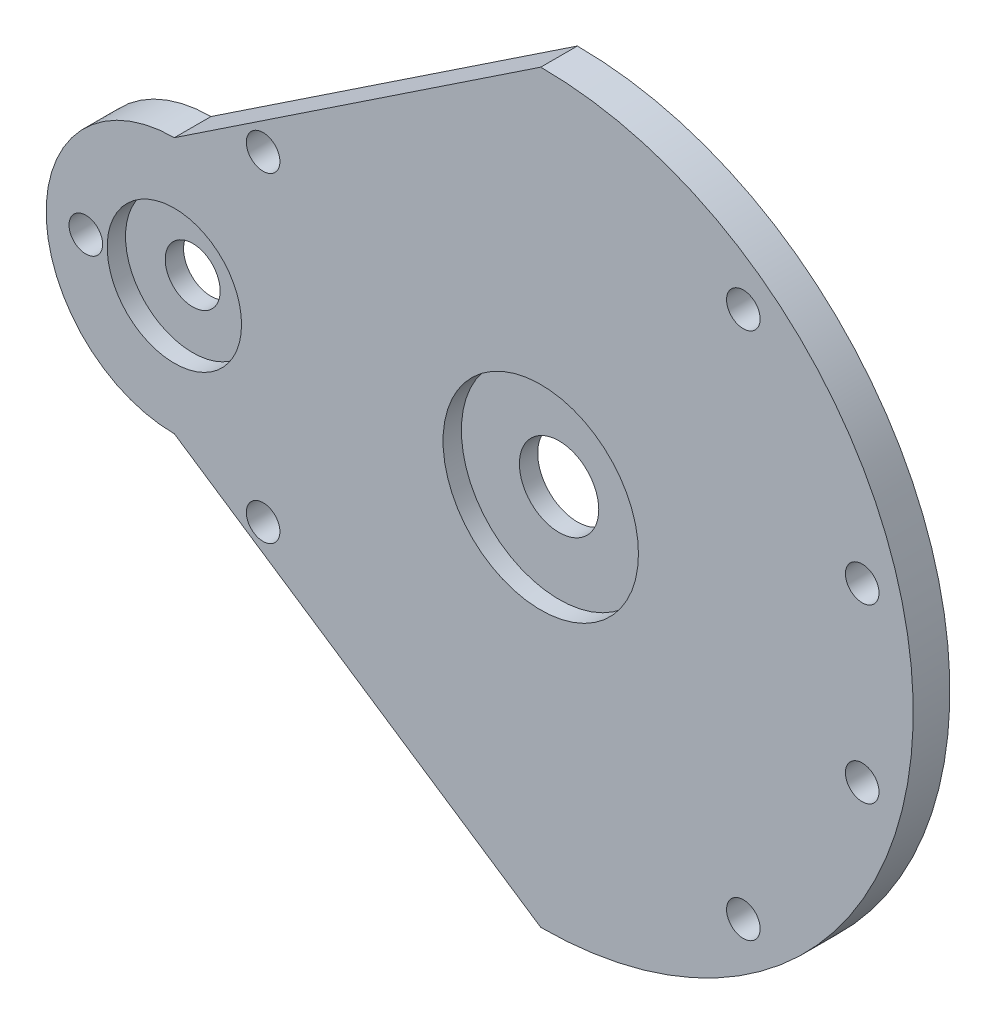
ISO-10303-21;
HEADER;
FILE_DESCRIPTION(('STEP AP214'),'2;1');
FILE_NAME('part.step','',(''),(''),'','','');
FILE_SCHEMA(('AUTOMOTIVE_DESIGN { 1 0 10303 214 1 1 1 1 }'));
ENDSEC;
DATA;
#1=APPLICATION_CONTEXT('core data for automotive mechanical design processes');
#2=APPLICATION_PROTOCOL_DEFINITION('international standard','automotive_design',2000,#1);
#3=PRODUCT_CONTEXT('',#1,'mechanical');
#4=PRODUCT('Part','Part','',(#3));
#5=PRODUCT_RELATED_PRODUCT_CATEGORY('part','',(#4));
#6=PRODUCT_DEFINITION_FORMATION('','',#4);
#7=PRODUCT_DEFINITION_CONTEXT('part definition',#1,'design');
#8=PRODUCT_DEFINITION('design','',#6,#7);
#9=PRODUCT_DEFINITION_SHAPE('','',#8);
#10=(LENGTH_UNIT() NAMED_UNIT(*) SI_UNIT(.MILLI.,.METRE.));
#11=(NAMED_UNIT(*) PLANE_ANGLE_UNIT() SI_UNIT($,.RADIAN.));
#12=(NAMED_UNIT(*) SI_UNIT($,.STERADIAN.) SOLID_ANGLE_UNIT());
#13=UNCERTAINTY_MEASURE_WITH_UNIT(LENGTH_MEASURE(1.E-05),#10,'distance_accuracy_value','');
#14=(GEOMETRIC_REPRESENTATION_CONTEXT(3) GLOBAL_UNCERTAINTY_ASSIGNED_CONTEXT((#13)) GLOBAL_UNIT_ASSIGNED_CONTEXT((#10,
#11,#12)) REPRESENTATION_CONTEXT('',''));
#15=CARTESIAN_POINT('',(0.,0.,0.));
#16=DIRECTION('',(0.,0.,1.));
#17=DIRECTION('',(1.,0.,0.));
#18=AXIS2_PLACEMENT_3D('',#15,#16,#17);
#19=CARTESIAN_POINT('',(0.,0.,-3.));
#20=DIRECTION('',(0.,0.,1.));
#21=DIRECTION('',(1.,0.,0.));
#22=AXIS2_PLACEMENT_3D('',#19,#20,#21);
#23=PLANE('',#22);
#24=CARTESIAN_POINT('',(0.,0.,-3.));
#25=DIRECTION('',(0.,0.,1.));
#26=DIRECTION('',(1.,0.,0.));
#27=AXIS2_PLACEMENT_3D('',#24,#25,#26);
#28=CIRCLE('',#27,4.5);
#29=CARTESIAN_POINT('',(4.5,0.,-3.));
#30=VERTEX_POINT('',#29);
#31=EDGE_CURVE('E340',#30,#30,#28,.T.);
#32=ORIENTED_EDGE('',*,*,#31,.T.);
#33=EDGE_LOOP('',(#32));
#34=FACE_BOUND('',#33,.T.);
#35=CARTESIAN_POINT('',(60.,0.,-3.));
#36=DIRECTION('',(0.,0.,1.));
#37=DIRECTION('',(1.,0.,0.));
#38=AXIS2_PLACEMENT_3D('',#35,#36,#37);
#39=CIRCLE('',#38,6.5);
#40=CARTESIAN_POINT('',(66.5,0.,-3.));
#41=VERTEX_POINT('',#40);
#42=EDGE_CURVE('E189',#41,#41,#39,.T.);
#43=ORIENTED_EDGE('',*,*,#42,.T.);
#44=EDGE_LOOP('',(#43));
#45=FACE_BOUND('',#44,.T.);
#46=CARTESIAN_POINT('',(0.,0.,-3.));
#47=DIRECTION('',(0.,0.,1.));
#48=DIRECTION('',(1.,0.,0.));
#49=AXIS2_PLACEMENT_3D('',#46,#47,#48);
#50=CIRCLE('',#49,21.);
#51=CARTESIAN_POINT('',(0.,21.,-3.));
#52=VERTEX_POINT('',#51);
#53=CARTESIAN_POINT('',(0.,-21.,-3.));
#54=VERTEX_POINT('',#53);
#55=EDGE_CURVE('E108',#52,#54,#50,.T.);
#56=ORIENTED_EDGE('',*,*,#55,.F.);
#57=DIRECTION('',(-0.832050294337844,-0.554700196225229,0.));
#58=VECTOR('',#57,1.);
#59=CARTESIAN_POINT('',(0.,21.,-3.));
#60=LINE('',#59,#58);
#61=CARTESIAN_POINT('',(60.,61.,-3.));
#62=VERTEX_POINT('',#61);
#63=EDGE_CURVE('E84',#62,#52,#60,.T.);
#64=ORIENTED_EDGE('',*,*,#63,.F.);
#65=CARTESIAN_POINT('',(60.,0.,-3.));
#66=DIRECTION('',(0.,0.,1.));
#67=DIRECTION('',(1.,0.,0.));
#68=AXIS2_PLACEMENT_3D('',#65,#66,#67);
#69=CIRCLE('',#68,61.);
#70=CARTESIAN_POINT('',(60.,-61.,-3.));
#71=VERTEX_POINT('',#70);
#72=EDGE_CURVE('E80',#71,#62,#69,.T.);
#73=ORIENTED_EDGE('',*,*,#72,.F.);
#74=DIRECTION('',(0.832050294337844,-0.554700196225229,0.));
#75=VECTOR('',#74,1.);
#76=CARTESIAN_POINT('',(0.,-21.,-3.));
#77=LINE('',#76,#75);
#78=EDGE_CURVE('E100',#54,#71,#77,.T.);
#79=ORIENTED_EDGE('',*,*,#78,.F.);
#80=EDGE_LOOP('',(#56,#64,#73,#79));
#81=FACE_BOUND('',#80,.T.);
#82=CARTESIAN_POINT('',(-14.5,0.,-3.000012));
#83=DIRECTION('',(0.,0.,-1.));
#84=DIRECTION('',(-1.,0.,0.));
#85=AXIS2_PLACEMENT_3D('',#82,#83,#84);
#86=CIRCLE('',#85,2.75);
#87=CARTESIAN_POINT('',(-17.25,0.,-3.000012));
#88=VERTEX_POINT('',#87);
#89=EDGE_CURVE('E122',#88,#88,#86,.T.);
#90=ORIENTED_EDGE('',*,*,#89,.F.);
#91=EDGE_LOOP('',(#90));
#92=FACE_BOUND('',#91,.T.);
#93=CARTESIAN_POINT('',(112.642957532754,-14.1056379580872,-3.000012));
#94=DIRECTION('',(0.,0.,-1.));
#95=DIRECTION('',(1.,0.,0.));
#96=AXIS2_PLACEMENT_3D('',#93,#94,#95);
#97=CIRCLE('',#96,2.75);
#98=CARTESIAN_POINT('',(115.392957532754,-14.1056379580872,-3.000012));
#99=VERTEX_POINT('',#98);
#100=EDGE_CURVE('E210',#99,#99,#97,.T.);
#101=ORIENTED_EDGE('',*,*,#100,.F.);
#102=EDGE_LOOP('',(#101));
#103=FACE_BOUND('',#102,.T.);
#104=CARTESIAN_POINT('',(93.177497880975,-43.2377570458725,-3.000012));
#105=DIRECTION('',(0.,0.,-1.));
#106=DIRECTION('',(1.,0.,0.));
#107=AXIS2_PLACEMENT_3D('',#104,#105,#106);
#108=CIRCLE('',#107,2.75);
#109=CARTESIAN_POINT('',(95.927497880975,-43.2377570458725,-3.000012));
#110=VERTEX_POINT('',#109);
#111=EDGE_CURVE('E196',#110,#110,#108,.T.);
#112=ORIENTED_EDGE('',*,*,#111,.F.);
#113=EDGE_LOOP('',(#112));
#114=FACE_BOUND('',#113,.T.);
#115=CARTESIAN_POINT('',(112.642957532754,14.1056379580872,-3.000012));
#116=DIRECTION('',(0.,0.,-1.));
#117=DIRECTION('',(-1.,0.,0.));
#118=AXIS2_PLACEMENT_3D('',#115,#116,#117);
#119=CIRCLE('',#118,2.75);
#120=CARTESIAN_POINT('',(109.892957532754,14.1056379580872,-3.000012));
#121=VERTEX_POINT('',#120);
#122=EDGE_CURVE('E187',#121,#121,#119,.T.);
#123=ORIENTED_EDGE('',*,*,#122,.F.);
#124=EDGE_LOOP('',(#123));
#125=FACE_BOUND('',#124,.T.);
#126=CARTESIAN_POINT('',(14.533666301317,26.2500000000001,-3.000012));
#127=DIRECTION('',(0.,0.,-1.));
#128=DIRECTION('',(-1.,0.,0.));
#129=AXIS2_PLACEMENT_3D('',#126,#127,#128);
#130=CIRCLE('',#129,2.75);
#131=CARTESIAN_POINT('',(11.783666301317,26.2500000000001,-3.000012));
#132=VERTEX_POINT('',#131);
#133=EDGE_CURVE('E306',#132,#132,#130,.T.);
#134=ORIENTED_EDGE('',*,*,#133,.F.);
#135=EDGE_LOOP('',(#134));
#136=FACE_BOUND('',#135,.T.);
#137=CARTESIAN_POINT('',(14.533666301317,-26.2500000000001,-3.000012));
#138=DIRECTION('',(0.,0.,-1.));
#139=DIRECTION('',(1.,0.,0.));
#140=AXIS2_PLACEMENT_3D('',#137,#138,#139);
#141=CIRCLE('',#140,2.75);
#142=CARTESIAN_POINT('',(17.283666301317,-26.2500000000001,-3.000012));
#143=VERTEX_POINT('',#142);
#144=EDGE_CURVE('E171',#143,#143,#141,.T.);
#145=ORIENTED_EDGE('',*,*,#144,.F.);
#146=EDGE_LOOP('',(#145));
#147=FACE_BOUND('',#146,.T.);
#148=CARTESIAN_POINT('',(93.177497880975,43.2377570458725,-3.000012));
#149=DIRECTION('',(0.,0.,-1.));
#150=DIRECTION('',(-1.,0.,0.));
#151=AXIS2_PLACEMENT_3D('',#148,#149,#150);
#152=CIRCLE('',#151,2.75);
#153=CARTESIAN_POINT('',(90.427497880975,43.2377570458725,-3.000012));
#154=VERTEX_POINT('',#153);
#155=EDGE_CURVE('E185',#154,#154,#152,.T.);
#156=ORIENTED_EDGE('',*,*,#155,.F.);
#157=EDGE_LOOP('',(#156));
#158=FACE_BOUND('',#157,.T.);
#159=ADVANCED_FACE('F39',(#34,#45,#81,#92,#103,#114,#125,#136,#147,#158),#23,.F.);
#160=CARTESIAN_POINT('',(0.,0.,3.));
#161=DIRECTION('',(0.,0.,-1.));
#162=DIRECTION('',(-1.,0.,0.));
#163=AXIS2_PLACEMENT_3D('',#160,#161,#162);
#164=CYLINDRICAL_SURFACE('',#163,21.);
#165=ORIENTED_EDGE('',*,*,#55,.T.);
#166=DIRECTION('',(0.,0.,-1.));
#167=VECTOR('',#166,1.);
#168=CARTESIAN_POINT('',(0.,-21.,3.));
#169=LINE('',#168,#167);
#170=CARTESIAN_POINT('',(0.,-21.,3.));
#171=VERTEX_POINT('',#170);
#172=EDGE_CURVE('E11',#171,#54,#169,.T.);
#173=ORIENTED_EDGE('',*,*,#172,.F.);
#174=CARTESIAN_POINT('',(0.,0.,3.));
#175=DIRECTION('',(0.,0.,1.));
#176=DIRECTION('',(1.,0.,0.));
#177=AXIS2_PLACEMENT_3D('',#174,#175,#176);
#178=CIRCLE('',#177,21.);
#179=CARTESIAN_POINT('',(0.,21.,3.));
#180=VERTEX_POINT('',#179);
#181=EDGE_CURVE('E91',#180,#171,#178,.T.);
#182=ORIENTED_EDGE('',*,*,#181,.F.);
#183=DIRECTION('',(0.,0.,-1.));
#184=VECTOR('',#183,1.);
#185=CARTESIAN_POINT('',(0.,21.,3.));
#186=LINE('',#185,#184);
#187=EDGE_CURVE('E104',#180,#52,#186,.T.);
#188=ORIENTED_EDGE('',*,*,#187,.T.);
#189=EDGE_LOOP('',(#165,#173,#182,#188));
#190=FACE_BOUND('',#189,.T.);
#191=ADVANCED_FACE('F41',(#190),#164,.T.);
#192=CARTESIAN_POINT('',(0.,-21.,3.));
#193=DIRECTION('',(0.554700196225229,0.832050294337843,0.));
#194=DIRECTION('',(-0.832050294337844,0.554700196225229,0.));
#195=AXIS2_PLACEMENT_3D('',#192,#193,#194);
#196=PLANE('',#195);
#197=ORIENTED_EDGE('',*,*,#78,.T.);
#198=DIRECTION('',(0.,0.,-1.));
#199=VECTOR('',#198,1.);
#200=CARTESIAN_POINT('',(60.,-61.,3.));
#201=LINE('',#200,#199);
#202=CARTESIAN_POINT('',(60.,-61.,3.));
#203=VERTEX_POINT('',#202);
#204=EDGE_CURVE('E51',#203,#71,#201,.T.);
#205=ORIENTED_EDGE('',*,*,#204,.F.);
#206=DIRECTION('',(0.832050294337844,-0.554700196225229,0.));
#207=VECTOR('',#206,1.);
#208=CARTESIAN_POINT('',(0.,-21.,3.));
#209=LINE('',#208,#207);
#210=EDGE_CURVE('E89',#171,#203,#209,.T.);
#211=ORIENTED_EDGE('',*,*,#210,.F.);
#212=ORIENTED_EDGE('',*,*,#172,.T.);
#213=EDGE_LOOP('',(#197,#205,#211,#212));
#214=FACE_BOUND('',#213,.T.);
#215=ADVANCED_FACE('F96',(#214),#196,.F.);
#216=CARTESIAN_POINT('',(60.,0.,3.));
#217=DIRECTION('',(0.,0.,-1.));
#218=DIRECTION('',(-1.,0.,0.));
#219=AXIS2_PLACEMENT_3D('',#216,#217,#218);
#220=CYLINDRICAL_SURFACE('',#219,61.);
#221=ORIENTED_EDGE('',*,*,#72,.T.);
#222=DIRECTION('',(0.,0.,-1.));
#223=VECTOR('',#222,1.);
#224=CARTESIAN_POINT('',(60.,61.,3.));
#225=LINE('',#224,#223);
#226=CARTESIAN_POINT('',(60.,61.,3.));
#227=VERTEX_POINT('',#226);
#228=EDGE_CURVE('E99',#227,#62,#225,.T.);
#229=ORIENTED_EDGE('',*,*,#228,.F.);
#230=CARTESIAN_POINT('',(60.,0.,3.));
#231=DIRECTION('',(0.,0.,1.));
#232=DIRECTION('',(1.,0.,0.));
#233=AXIS2_PLACEMENT_3D('',#230,#231,#232);
#234=CIRCLE('',#233,61.);
#235=EDGE_CURVE('E93',#203,#227,#234,.T.);
#236=ORIENTED_EDGE('',*,*,#235,.F.);
#237=ORIENTED_EDGE('',*,*,#204,.T.);
#238=EDGE_LOOP('',(#221,#229,#236,#237));
#239=FACE_BOUND('',#238,.T.);
#240=ADVANCED_FACE('F105',(#239),#220,.T.);
#241=CARTESIAN_POINT('',(0.,21.,3.));
#242=DIRECTION('',(0.554700196225229,-0.832050294337843,0.));
#243=DIRECTION('',(0.832050294337844,0.554700196225229,0.));
#244=AXIS2_PLACEMENT_3D('',#241,#242,#243);
#245=PLANE('',#244);
#246=ORIENTED_EDGE('',*,*,#63,.T.);
#247=ORIENTED_EDGE('',*,*,#187,.F.);
#248=DIRECTION('',(-0.832050294337844,-0.554700196225229,0.));
#249=VECTOR('',#248,1.);
#250=CARTESIAN_POINT('',(0.,21.,3.));
#251=LINE('',#250,#249);
#252=EDGE_CURVE('E58',#227,#180,#251,.T.);
#253=ORIENTED_EDGE('',*,*,#252,.F.);
#254=ORIENTED_EDGE('',*,*,#228,.T.);
#255=EDGE_LOOP('',(#246,#247,#253,#254));
#256=FACE_BOUND('',#255,.T.);
#257=ADVANCED_FACE('F138',(#256),#245,.F.);
#258=CARTESIAN_POINT('',(0.,0.,3.));
#259=DIRECTION('',(0.,0.,1.));
#260=DIRECTION('',(1.,0.,0.));
#261=AXIS2_PLACEMENT_3D('',#258,#259,#260);
#262=PLANE('',#261);
#263=CARTESIAN_POINT('',(93.177497880975,43.2377570458725,3.));
#264=DIRECTION('',(0.,0.,-1.));
#265=DIRECTION('',(-1.,0.,0.));
#266=AXIS2_PLACEMENT_3D('',#263,#264,#265);
#267=CIRCLE('',#266,2.75000000000001);
#268=CARTESIAN_POINT('',(90.427497880975,43.2377570458725,3.));
#269=VERTEX_POINT('',#268);
#270=EDGE_CURVE('E184',#269,#269,#267,.T.);
#271=ORIENTED_EDGE('',*,*,#270,.T.);
#272=EDGE_LOOP('',(#271));
#273=FACE_BOUND('',#272,.T.);
#274=CARTESIAN_POINT('',(14.533666301317,-26.2500000000001,3.));
#275=DIRECTION('',(0.,0.,-1.));
#276=DIRECTION('',(1.,0.,0.));
#277=AXIS2_PLACEMENT_3D('',#274,#275,#276);
#278=CIRCLE('',#277,2.75);
#279=CARTESIAN_POINT('',(17.283666301317,-26.2500000000001,3.));
#280=VERTEX_POINT('',#279);
#281=EDGE_CURVE('E301',#280,#280,#278,.T.);
#282=ORIENTED_EDGE('',*,*,#281,.T.);
#283=EDGE_LOOP('',(#282));
#284=FACE_BOUND('',#283,.T.);
#285=CARTESIAN_POINT('',(14.533666301317,26.2500000000001,3.));
#286=DIRECTION('',(0.,0.,-1.));
#287=DIRECTION('',(-1.,0.,0.));
#288=AXIS2_PLACEMENT_3D('',#285,#286,#287);
#289=CIRCLE('',#288,2.75);
#290=CARTESIAN_POINT('',(11.783666301317,26.2500000000001,3.));
#291=VERTEX_POINT('',#290);
#292=EDGE_CURVE('E302',#291,#291,#289,.T.);
#293=ORIENTED_EDGE('',*,*,#292,.T.);
#294=EDGE_LOOP('',(#293));
#295=FACE_BOUND('',#294,.T.);
#296=CARTESIAN_POINT('',(112.642957532754,14.1056379580872,3.));
#297=DIRECTION('',(0.,0.,-1.));
#298=DIRECTION('',(-1.,0.,0.));
#299=AXIS2_PLACEMENT_3D('',#296,#297,#298);
#300=CIRCLE('',#299,2.75000000000001);
#301=CARTESIAN_POINT('',(109.892957532754,14.1056379580872,3.));
#302=VERTEX_POINT('',#301);
#303=EDGE_CURVE('E192',#302,#302,#300,.T.);
#304=ORIENTED_EDGE('',*,*,#303,.T.);
#305=EDGE_LOOP('',(#304));
#306=FACE_BOUND('',#305,.T.);
#307=CARTESIAN_POINT('',(93.177497880975,-43.2377570458725,3.));
#308=DIRECTION('',(0.,0.,-1.));
#309=DIRECTION('',(1.,0.,0.));
#310=AXIS2_PLACEMENT_3D('',#307,#308,#309);
#311=CIRCLE('',#310,2.75000000000001);
#312=CARTESIAN_POINT('',(95.927497880975,-43.2377570458725,3.));
#313=VERTEX_POINT('',#312);
#314=EDGE_CURVE('E202',#313,#313,#311,.T.);
#315=ORIENTED_EDGE('',*,*,#314,.T.);
#316=EDGE_LOOP('',(#315));
#317=FACE_BOUND('',#316,.T.);
#318=CARTESIAN_POINT('',(112.642957532754,-14.1056379580872,3.));
#319=DIRECTION('',(0.,0.,-1.));
#320=DIRECTION('',(1.,0.,0.));
#321=AXIS2_PLACEMENT_3D('',#318,#319,#320);
#322=CIRCLE('',#321,2.75000000000001);
#323=CARTESIAN_POINT('',(115.392957532754,-14.1056379580872,3.));
#324=VERTEX_POINT('',#323);
#325=EDGE_CURVE('E296',#324,#324,#322,.T.);
#326=ORIENTED_EDGE('',*,*,#325,.T.);
#327=EDGE_LOOP('',(#326));
#328=FACE_BOUND('',#327,.T.);
#329=CARTESIAN_POINT('',(-14.5,0.,3.));
#330=DIRECTION('',(0.,0.,-1.));
#331=DIRECTION('',(-1.,0.,0.));
#332=AXIS2_PLACEMENT_3D('',#329,#330,#331);
#333=CIRCLE('',#332,2.75);
#334=CARTESIAN_POINT('',(-17.25,0.,3.));
#335=VERTEX_POINT('',#334);
#336=EDGE_CURVE('E204',#335,#335,#333,.T.);
#337=ORIENTED_EDGE('',*,*,#336,.T.);
#338=EDGE_LOOP('',(#337));
#339=FACE_BOUND('',#338,.T.);
#340=CARTESIAN_POINT('',(0.,0.,3.));
#341=DIRECTION('',(0.,0.,1.));
#342=DIRECTION('',(1.,0.,0.));
#343=AXIS2_PLACEMENT_3D('',#340,#341,#342);
#344=CIRCLE('',#343,11.);
#345=CARTESIAN_POINT('',(11.,0.,3.));
#346=VERTEX_POINT('',#345);
#347=EDGE_CURVE('E328',#346,#346,#344,.T.);
#348=ORIENTED_EDGE('',*,*,#347,.F.);
#349=EDGE_LOOP('',(#348));
#350=FACE_BOUND('',#349,.T.);
#351=CARTESIAN_POINT('',(60.,0.,3.));
#352=DIRECTION('',(0.,0.,1.));
#353=DIRECTION('',(1.,0.,0.));
#354=AXIS2_PLACEMENT_3D('',#351,#352,#353);
#355=CIRCLE('',#354,16.);
#356=CARTESIAN_POINT('',(76.,0.,3.));
#357=VERTEX_POINT('',#356);
#358=EDGE_CURVE('E332',#357,#357,#355,.T.);
#359=ORIENTED_EDGE('',*,*,#358,.F.);
#360=EDGE_LOOP('',(#359));
#361=FACE_BOUND('',#360,.T.);
#362=ORIENTED_EDGE('',*,*,#181,.T.);
#363=ORIENTED_EDGE('',*,*,#210,.T.);
#364=ORIENTED_EDGE('',*,*,#235,.T.);
#365=ORIENTED_EDGE('',*,*,#252,.T.);
#366=EDGE_LOOP('',(#362,#363,#364,#365));
#367=FACE_BOUND('',#366,.T.);
#368=ADVANCED_FACE('F92',(#273,#284,#295,#306,#317,#328,#339,#350,#361,#367),#262,.T.);
#369=CARTESIAN_POINT('',(60.,0.,0.));
#370=DIRECTION('',(0.,0.,1.));
#371=DIRECTION('',(1.,0.,0.));
#372=AXIS2_PLACEMENT_3D('',#369,#370,#371);
#373=CYLINDRICAL_SURFACE('',#372,16.);
#374=CARTESIAN_POINT('',(60.,0.,0.));
#375=DIRECTION('',(0.,0.,1.));
#376=DIRECTION('',(1.,0.,0.));
#377=AXIS2_PLACEMENT_3D('',#374,#375,#376);
#378=CIRCLE('',#377,16.);
#379=CARTESIAN_POINT('',(76.,0.,0.));
#380=VERTEX_POINT('',#379);
#381=EDGE_CURVE('E333',#380,#380,#378,.T.);
#382=ORIENTED_EDGE('',*,*,#381,.F.);
#383=EDGE_LOOP('',(#382));
#384=FACE_BOUND('',#383,.T.);
#385=ORIENTED_EDGE('',*,*,#358,.T.);
#386=EDGE_LOOP('',(#385));
#387=FACE_BOUND('',#386,.T.);
#388=ADVANCED_FACE('F320',(#384,#387),#373,.F.);
#389=CARTESIAN_POINT('',(60.,0.,0.));
#390=DIRECTION('',(0.,0.,1.));
#391=DIRECTION('',(1.,0.,0.));
#392=AXIS2_PLACEMENT_3D('',#389,#390,#391);
#393=PLANE('',#392);
#394=CARTESIAN_POINT('',(60.,0.,0.));
#395=DIRECTION('',(0.,0.,1.));
#396=DIRECTION('',(1.,0.,0.));
#397=AXIS2_PLACEMENT_3D('',#394,#395,#396);
#398=CIRCLE('',#397,6.5);
#399=CARTESIAN_POINT('',(66.5,0.,0.));
#400=VERTEX_POINT('',#399);
#401=EDGE_CURVE('E341',#400,#400,#398,.T.);
#402=ORIENTED_EDGE('',*,*,#401,.F.);
#403=EDGE_LOOP('',(#402));
#404=FACE_BOUND('',#403,.T.);
#405=ORIENTED_EDGE('',*,*,#381,.T.);
#406=EDGE_LOOP('',(#405));
#407=FACE_BOUND('',#406,.T.);
#408=ADVANCED_FACE('F374',(#404,#407),#393,.T.);
#409=CARTESIAN_POINT('',(0.,0.,0.));
#410=DIRECTION('',(0.,0.,1.));
#411=DIRECTION('',(1.,0.,0.));
#412=AXIS2_PLACEMENT_3D('',#409,#410,#411);
#413=CYLINDRICAL_SURFACE('',#412,11.);
#414=CARTESIAN_POINT('',(0.,0.,0.));
#415=DIRECTION('',(0.,0.,1.));
#416=DIRECTION('',(1.,0.,0.));
#417=AXIS2_PLACEMENT_3D('',#414,#415,#416);
#418=CIRCLE('',#417,11.);
#419=CARTESIAN_POINT('',(11.,0.,0.));
#420=VERTEX_POINT('',#419);
#421=EDGE_CURVE('E111',#420,#420,#418,.T.);
#422=ORIENTED_EDGE('',*,*,#421,.F.);
#423=EDGE_LOOP('',(#422));
#424=FACE_BOUND('',#423,.T.);
#425=ORIENTED_EDGE('',*,*,#347,.T.);
#426=EDGE_LOOP('',(#425));
#427=FACE_BOUND('',#426,.T.);
#428=ADVANCED_FACE('F367',(#424,#427),#413,.F.);
#429=CARTESIAN_POINT('',(0.,0.,0.));
#430=DIRECTION('',(0.,0.,1.));
#431=DIRECTION('',(1.,0.,0.));
#432=AXIS2_PLACEMENT_3D('',#429,#430,#431);
#433=PLANE('',#432);
#434=CARTESIAN_POINT('',(0.,0.,0.));
#435=DIRECTION('',(0.,0.,1.));
#436=DIRECTION('',(1.,0.,0.));
#437=AXIS2_PLACEMENT_3D('',#434,#435,#436);
#438=CIRCLE('',#437,4.5);
#439=CARTESIAN_POINT('',(4.5,0.,0.));
#440=VERTEX_POINT('',#439);
#441=EDGE_CURVE('E350',#440,#440,#438,.T.);
#442=ORIENTED_EDGE('',*,*,#441,.F.);
#443=EDGE_LOOP('',(#442));
#444=FACE_BOUND('',#443,.T.);
#445=ORIENTED_EDGE('',*,*,#421,.T.);
#446=EDGE_LOOP('',(#445));
#447=FACE_BOUND('',#446,.T.);
#448=ADVANCED_FACE('F366',(#444,#447),#433,.T.);
#449=CARTESIAN_POINT('',(60.,0.,-3.));
#450=DIRECTION('',(0.,0.,1.));
#451=DIRECTION('',(1.,0.,0.));
#452=AXIS2_PLACEMENT_3D('',#449,#450,#451);
#453=CYLINDRICAL_SURFACE('',#452,6.5);
#454=ORIENTED_EDGE('',*,*,#42,.F.);
#455=EDGE_LOOP('',(#454));
#456=FACE_BOUND('',#455,.T.);
#457=ORIENTED_EDGE('',*,*,#401,.T.);
#458=EDGE_LOOP('',(#457));
#459=FACE_BOUND('',#458,.T.);
#460=ADVANCED_FACE('F361',(#456,#459),#453,.F.);
#461=CARTESIAN_POINT('',(0.,0.,-3.));
#462=DIRECTION('',(0.,0.,1.));
#463=DIRECTION('',(1.,0.,0.));
#464=AXIS2_PLACEMENT_3D('',#461,#462,#463);
#465=CYLINDRICAL_SURFACE('',#464,4.5);
#466=ORIENTED_EDGE('',*,*,#31,.F.);
#467=EDGE_LOOP('',(#466));
#468=FACE_BOUND('',#467,.T.);
#469=ORIENTED_EDGE('',*,*,#441,.T.);
#470=EDGE_LOOP('',(#469));
#471=FACE_BOUND('',#470,.T.);
#472=ADVANCED_FACE('F270',(#468,#471),#465,.F.);
#473=CARTESIAN_POINT('',(-14.5,0.,3.));
#474=DIRECTION('',(0.,0.,-1.));
#475=DIRECTION('',(-1.,0.,0.));
#476=AXIS2_PLACEMENT_3D('',#473,#474,#475);
#477=CYLINDRICAL_SURFACE('',#476,2.75);
#478=ORIENTED_EDGE('',*,*,#336,.F.);
#479=EDGE_LOOP('',(#478));
#480=FACE_BOUND('',#479,.T.);
#481=ORIENTED_EDGE('',*,*,#89,.T.);
#482=EDGE_LOOP('',(#481));
#483=FACE_BOUND('',#482,.T.);
#484=ADVANCED_FACE('F258',(#480,#483),#477,.F.);
#485=CARTESIAN_POINT('',(112.642957532754,-14.1056379580872,3.));
#486=DIRECTION('',(0.,0.,-1.));
#487=DIRECTION('',(-1.,0.,0.));
#488=AXIS2_PLACEMENT_3D('',#485,#486,#487);
#489=CYLINDRICAL_SURFACE('',#488,2.75000000000001);
#490=ORIENTED_EDGE('',*,*,#325,.F.);
#491=EDGE_LOOP('',(#490));
#492=FACE_BOUND('',#491,.T.);
#493=ORIENTED_EDGE('',*,*,#100,.T.);
#494=EDGE_LOOP('',(#493));
#495=FACE_BOUND('',#494,.T.);
#496=ADVANCED_FACE('F264',(#492,#495),#489,.F.);
#497=CARTESIAN_POINT('',(93.177497880975,-43.2377570458725,3.));
#498=DIRECTION('',(0.,0.,-1.));
#499=DIRECTION('',(-1.,0.,0.));
#500=AXIS2_PLACEMENT_3D('',#497,#498,#499);
#501=CYLINDRICAL_SURFACE('',#500,2.75000000000001);
#502=ORIENTED_EDGE('',*,*,#314,.F.);
#503=EDGE_LOOP('',(#502));
#504=FACE_BOUND('',#503,.T.);
#505=ORIENTED_EDGE('',*,*,#111,.T.);
#506=EDGE_LOOP('',(#505));
#507=FACE_BOUND('',#506,.T.);
#508=ADVANCED_FACE('F259',(#504,#507),#501,.F.);
#509=CARTESIAN_POINT('',(112.642957532754,14.1056379580872,3.));
#510=DIRECTION('',(0.,0.,-1.));
#511=DIRECTION('',(-1.,0.,0.));
#512=AXIS2_PLACEMENT_3D('',#509,#510,#511);
#513=CYLINDRICAL_SURFACE('',#512,2.75000000000001);
#514=ORIENTED_EDGE('',*,*,#303,.F.);
#515=EDGE_LOOP('',(#514));
#516=FACE_BOUND('',#515,.T.);
#517=ORIENTED_EDGE('',*,*,#122,.T.);
#518=EDGE_LOOP('',(#517));
#519=FACE_BOUND('',#518,.T.);
#520=ADVANCED_FACE('F230',(#516,#519),#513,.F.);
#521=CARTESIAN_POINT('',(14.533666301317,26.2500000000001,3.));
#522=DIRECTION('',(0.,0.,-1.));
#523=DIRECTION('',(-1.,0.,0.));
#524=AXIS2_PLACEMENT_3D('',#521,#522,#523);
#525=CYLINDRICAL_SURFACE('',#524,2.75);
#526=ORIENTED_EDGE('',*,*,#292,.F.);
#527=EDGE_LOOP('',(#526));
#528=FACE_BOUND('',#527,.T.);
#529=ORIENTED_EDGE('',*,*,#133,.T.);
#530=EDGE_LOOP('',(#529));
#531=FACE_BOUND('',#530,.T.);
#532=ADVANCED_FACE('F221',(#528,#531),#525,.F.);
#533=CARTESIAN_POINT('',(14.533666301317,-26.2500000000001,3.));
#534=DIRECTION('',(0.,0.,-1.));
#535=DIRECTION('',(-1.,0.,0.));
#536=AXIS2_PLACEMENT_3D('',#533,#534,#535);
#537=CYLINDRICAL_SURFACE('',#536,2.75);
#538=ORIENTED_EDGE('',*,*,#281,.F.);
#539=EDGE_LOOP('',(#538));
#540=FACE_BOUND('',#539,.T.);
#541=ORIENTED_EDGE('',*,*,#144,.T.);
#542=EDGE_LOOP('',(#541));
#543=FACE_BOUND('',#542,.T.);
#544=ADVANCED_FACE('F223',(#540,#543),#537,.F.);
#545=CARTESIAN_POINT('',(93.177497880975,43.2377570458725,3.));
#546=DIRECTION('',(0.,0.,-1.));
#547=DIRECTION('',(-1.,0.,0.));
#548=AXIS2_PLACEMENT_3D('',#545,#546,#547);
#549=CYLINDRICAL_SURFACE('',#548,2.75000000000001);
#550=ORIENTED_EDGE('',*,*,#270,.F.);
#551=EDGE_LOOP('',(#550));
#552=FACE_BOUND('',#551,.T.);
#553=ORIENTED_EDGE('',*,*,#155,.T.);
#554=EDGE_LOOP('',(#553));
#555=FACE_BOUND('',#554,.T.);
#556=ADVANCED_FACE('F211',(#552,#555),#549,.F.);
#557=CLOSED_SHELL('',(#159,#191,#215,#240,#257,#368,#388,#408,#428,#448,#460,#472,#484,#496,
#508,#520,#532,#544,#556));
#558=MANIFOLD_SOLID_BREP('B2',#557);
#559=ADVANCED_BREP_SHAPE_REPRESENTATION('',(#18,#558),#14);
#560=SHAPE_DEFINITION_REPRESENTATION(#9,#559);
ENDSEC;
END-ISO-10303-21;
